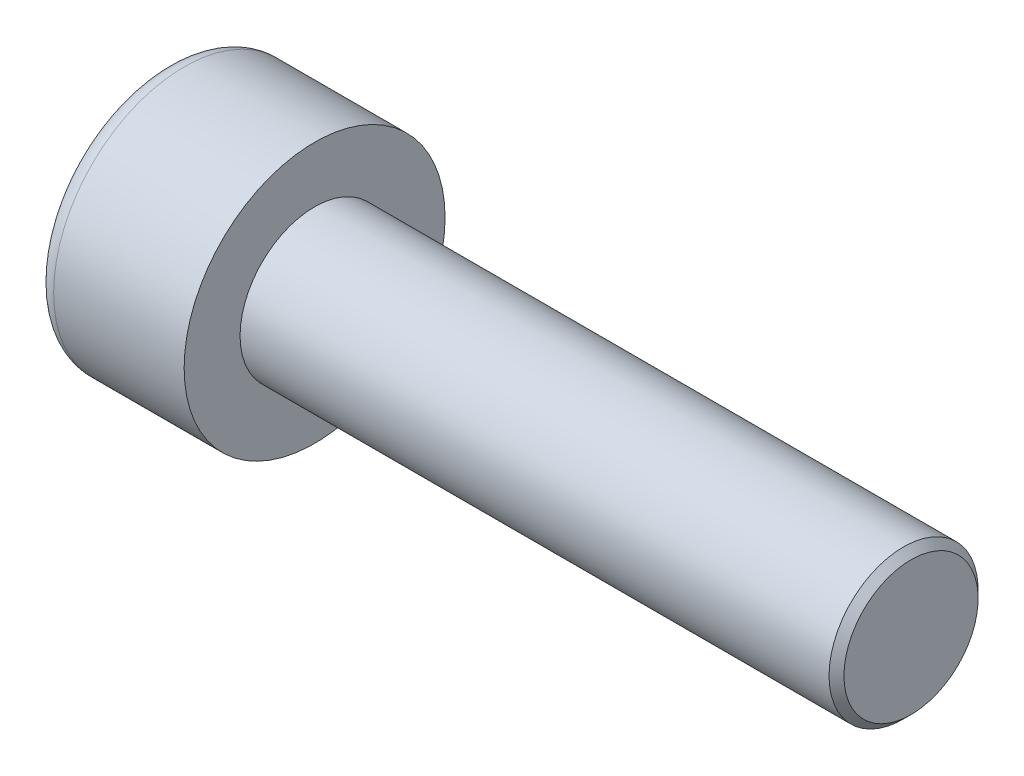
ISO-10303-21;
HEADER;
FILE_DESCRIPTION(('STEP AP214'),'2;1');
FILE_NAME('part.step','',(''),(''),'','','');
FILE_SCHEMA(('AUTOMOTIVE_DESIGN { 1 0 10303 214 1 1 1 1 }'));
ENDSEC;
DATA;
#1=APPLICATION_CONTEXT('core data for automotive mechanical design processes');
#2=APPLICATION_PROTOCOL_DEFINITION('international standard','automotive_design',2000,#1);
#3=PRODUCT_CONTEXT('',#1,'mechanical');
#4=PRODUCT('Part','Part','',(#3));
#5=PRODUCT_RELATED_PRODUCT_CATEGORY('part','',(#4));
#6=PRODUCT_DEFINITION_FORMATION('','',#4);
#7=PRODUCT_DEFINITION_CONTEXT('part definition',#1,'design');
#8=PRODUCT_DEFINITION('design','',#6,#7);
#9=PRODUCT_DEFINITION_SHAPE('','',#8);
#10=(LENGTH_UNIT() NAMED_UNIT(*) SI_UNIT(.MILLI.,.METRE.));
#11=(NAMED_UNIT(*) PLANE_ANGLE_UNIT() SI_UNIT($,.RADIAN.));
#12=(NAMED_UNIT(*) SI_UNIT($,.STERADIAN.) SOLID_ANGLE_UNIT());
#13=UNCERTAINTY_MEASURE_WITH_UNIT(LENGTH_MEASURE(1.E-05),#10,'distance_accuracy_value','');
#14=(GEOMETRIC_REPRESENTATION_CONTEXT(3) GLOBAL_UNCERTAINTY_ASSIGNED_CONTEXT((#13)) GLOBAL_UNIT_ASSIGNED_CONTEXT((#10,
#11,#12)) REPRESENTATION_CONTEXT('',''));
#15=CARTESIAN_POINT('',(0.,0.,0.));
#16=DIRECTION('',(0.,0.,1.));
#17=DIRECTION('',(1.,0.,0.));
#18=AXIS2_PLACEMENT_3D('',#15,#16,#17);
#19=CARTESIAN_POINT('',(0.,0.,0.));
#20=DIRECTION('',(1.,0.,0.));
#21=DIRECTION('',(0.,0.,-1.));
#22=AXIS2_PLACEMENT_3D('',#19,#20,#21);
#23=PLANE('',#22);
#24=DIRECTION('',(0.,0.866025403784439,0.5));
#25=VECTOR('',#24,1.);
#26=CARTESIAN_POINT('',(0.,-1.5,0.866025403784439));
#27=LINE('',#26,#25);
#28=CARTESIAN_POINT('',(0.,-1.5,0.866025403784439));
#29=VERTEX_POINT('',#28);
#30=CARTESIAN_POINT('',(0.,0.,1.73205080756887));
#31=VERTEX_POINT('',#30);
#32=EDGE_CURVE('E91',#29,#31,#27,.T.);
#33=ORIENTED_EDGE('',*,*,#32,.F.);
#34=DIRECTION('',(0.,0.,1.));
#35=VECTOR('',#34,1.);
#36=CARTESIAN_POINT('',(0.,-1.5,-0.866025403784439));
#37=LINE('',#36,#35);
#38=CARTESIAN_POINT('',(0.,-1.5,-0.866025403784439));
#39=VERTEX_POINT('',#38);
#40=EDGE_CURVE('E33',#39,#29,#37,.T.);
#41=ORIENTED_EDGE('',*,*,#40,.F.);
#42=DIRECTION('',(0.,-0.866025403784439,0.5));
#43=VECTOR('',#42,1.);
#44=CARTESIAN_POINT('',(0.,0.,-1.73205080756888));
#45=LINE('',#44,#43);
#46=CARTESIAN_POINT('',(0.,0.,-1.73205080756888));
#47=VERTEX_POINT('',#46);
#48=EDGE_CURVE('E106',#47,#39,#45,.T.);
#49=ORIENTED_EDGE('',*,*,#48,.F.);
#50=DIRECTION('',(0.,-0.866025403784439,-0.5));
#51=VECTOR('',#50,1.);
#52=CARTESIAN_POINT('',(0.,1.5,-0.866025403784439));
#53=LINE('',#52,#51);
#54=CARTESIAN_POINT('',(0.,1.5,-0.866025403784439));
#55=VERTEX_POINT('',#54);
#56=EDGE_CURVE('E100',#55,#47,#53,.T.);
#57=ORIENTED_EDGE('',*,*,#56,.F.);
#58=DIRECTION('',(0.,0.,-1.));
#59=VECTOR('',#58,1.);
#60=CARTESIAN_POINT('',(0.,1.5,0.866025403784437));
#61=LINE('',#60,#59);
#62=CARTESIAN_POINT('',(0.,1.5,0.866025403784437));
#63=VERTEX_POINT('',#62);
#64=EDGE_CURVE('E98',#63,#55,#61,.T.);
#65=ORIENTED_EDGE('',*,*,#64,.F.);
#66=DIRECTION('',(0.,0.866025403784439,-0.5));
#67=VECTOR('',#66,1.);
#68=CARTESIAN_POINT('',(0.,0.,1.73205080756887));
#69=LINE('',#68,#67);
#70=EDGE_CURVE('E84',#31,#63,#69,.T.);
#71=ORIENTED_EDGE('',*,*,#70,.F.);
#72=EDGE_LOOP('',(#33,#41,#49,#57,#65,#71));
#73=FACE_BOUND('',#72,.T.);
#74=CARTESIAN_POINT('',(0.,0.,0.));
#75=DIRECTION('',(-1.,0.,0.));
#76=DIRECTION('',(0.,0.,1.));
#77=AXIS2_PLACEMENT_3D('',#74,#75,#76);
#78=CIRCLE('',#77,3.);
#79=CARTESIAN_POINT('',(0.,0.,3.));
#80=VERTEX_POINT('',#79);
#81=EDGE_CURVE('E12',#80,#80,#78,.T.);
#82=ORIENTED_EDGE('',*,*,#81,.T.);
#83=EDGE_LOOP('',(#82));
#84=FACE_BOUND('',#83,.T.);
#85=ADVANCED_FACE('F19',(#73,#84),#23,.F.);
#86=CARTESIAN_POINT('',(0.5,0.,0.));
#87=DIRECTION('',(-1.,0.,0.));
#88=DIRECTION('',(0.,0.,1.));
#89=AXIS2_PLACEMENT_3D('',#86,#87,#88);
#90=TOROIDAL_SURFACE('',#89,3.,0.5);
#91=ORIENTED_EDGE('',*,*,#81,.F.);
#92=EDGE_LOOP('',(#91));
#93=FACE_BOUND('',#92,.T.);
#94=CARTESIAN_POINT('',(0.5,0.,0.));
#95=DIRECTION('',(-1.,0.,0.));
#96=DIRECTION('',(0.,0.,1.));
#97=AXIS2_PLACEMENT_3D('',#94,#95,#96);
#98=CIRCLE('',#97,3.5);
#99=CARTESIAN_POINT('',(0.5,0.,3.5));
#100=VERTEX_POINT('',#99);
#101=EDGE_CURVE('E26',#100,#100,#98,.T.);
#102=ORIENTED_EDGE('',*,*,#101,.T.);
#103=EDGE_LOOP('',(#102));
#104=FACE_BOUND('',#103,.T.);
#105=ADVANCED_FACE('F132',(#93,#104),#90,.T.);
#106=CARTESIAN_POINT('',(0.,0.,0.));
#107=DIRECTION('',(-1.,0.,0.));
#108=DIRECTION('',(0.,0.,1.));
#109=AXIS2_PLACEMENT_3D('',#106,#107,#108);
#110=CYLINDRICAL_SURFACE('',#109,3.5);
#111=ORIENTED_EDGE('',*,*,#101,.F.);
#112=EDGE_LOOP('',(#111));
#113=FACE_BOUND('',#112,.T.);
#114=CARTESIAN_POINT('',(4.,0.,0.));
#115=DIRECTION('',(-1.,0.,0.));
#116=DIRECTION('',(0.,0.,1.));
#117=AXIS2_PLACEMENT_3D('',#114,#115,#116);
#118=CIRCLE('',#117,3.5);
#119=CARTESIAN_POINT('',(4.,0.,3.5));
#120=VERTEX_POINT('',#119);
#121=EDGE_CURVE('E127',#120,#120,#118,.T.);
#122=ORIENTED_EDGE('',*,*,#121,.T.);
#123=EDGE_LOOP('',(#122));
#124=FACE_BOUND('',#123,.T.);
#125=ADVANCED_FACE('F134',(#113,#124),#110,.T.);
#126=CARTESIAN_POINT('',(4.,3.5,0.));
#127=DIRECTION('',(-1.,0.,0.));
#128=DIRECTION('',(0.,0.,1.));
#129=AXIS2_PLACEMENT_3D('',#126,#127,#128);
#130=PLANE('',#129);
#131=ORIENTED_EDGE('',*,*,#121,.F.);
#132=EDGE_LOOP('',(#131));
#133=FACE_BOUND('',#132,.T.);
#134=CARTESIAN_POINT('',(4.,0.,0.));
#135=DIRECTION('',(-1.,0.,0.));
#136=DIRECTION('',(0.,0.,1.));
#137=AXIS2_PLACEMENT_3D('',#134,#135,#136);
#138=CIRCLE('',#137,2.);
#139=CARTESIAN_POINT('',(4.,0.,2.));
#140=VERTEX_POINT('',#139);
#141=EDGE_CURVE('E124',#140,#140,#138,.T.);
#142=ORIENTED_EDGE('',*,*,#141,.T.);
#143=EDGE_LOOP('',(#142));
#144=FACE_BOUND('',#143,.T.);
#145=ADVANCED_FACE('F137',(#133,#144),#130,.F.);
#146=CARTESIAN_POINT('',(0.,0.,0.));
#147=DIRECTION('',(-1.,0.,0.));
#148=DIRECTION('',(0.,0.,1.));
#149=AXIS2_PLACEMENT_3D('',#146,#147,#148);
#150=CYLINDRICAL_SURFACE('',#149,2.);
#151=ORIENTED_EDGE('',*,*,#141,.F.);
#152=EDGE_LOOP('',(#151));
#153=FACE_BOUND('',#152,.T.);
#154=CARTESIAN_POINT('',(19.8,0.,0.));
#155=DIRECTION('',(-1.,0.,0.));
#156=DIRECTION('',(0.,0.,1.));
#157=AXIS2_PLACEMENT_3D('',#154,#155,#156);
#158=CIRCLE('',#157,2.);
#159=CARTESIAN_POINT('',(19.8,0.,2.));
#160=VERTEX_POINT('',#159);
#161=EDGE_CURVE('E121',#160,#160,#158,.T.);
#162=ORIENTED_EDGE('',*,*,#161,.T.);
#163=EDGE_LOOP('',(#162));
#164=FACE_BOUND('',#163,.T.);
#165=ADVANCED_FACE('F143',(#153,#164),#150,.T.);
#166=CARTESIAN_POINT('',(20.,0.,0.));
#167=DIRECTION('',(-1.,0.,0.));
#168=DIRECTION('',(0.,0.,1.));
#169=AXIS2_PLACEMENT_3D('',#166,#167,#168);
#170=CONICAL_SURFACE('',#169,1.8,0.785398163397452);
#171=ORIENTED_EDGE('',*,*,#161,.F.);
#172=EDGE_LOOP('',(#171));
#173=FACE_BOUND('',#172,.T.);
#174=CARTESIAN_POINT('',(20.,0.,0.));
#175=DIRECTION('',(-1.,0.,0.));
#176=DIRECTION('',(0.,0.,1.));
#177=AXIS2_PLACEMENT_3D('',#174,#175,#176);
#178=CIRCLE('',#177,1.8);
#179=CARTESIAN_POINT('',(20.,0.,1.8));
#180=VERTEX_POINT('',#179);
#181=EDGE_CURVE('E118',#180,#180,#178,.T.);
#182=ORIENTED_EDGE('',*,*,#181,.T.);
#183=EDGE_LOOP('',(#182));
#184=FACE_BOUND('',#183,.T.);
#185=ADVANCED_FACE('F149',(#173,#184),#170,.T.);
#186=CARTESIAN_POINT('',(20.,1.8,0.));
#187=DIRECTION('',(-1.,0.,0.));
#188=DIRECTION('',(0.,0.,1.));
#189=AXIS2_PLACEMENT_3D('',#186,#187,#188);
#190=PLANE('',#189);
#191=ORIENTED_EDGE('',*,*,#181,.F.);
#192=EDGE_LOOP('',(#191));
#193=FACE_BOUND('',#192,.T.);
#194=ADVANCED_FACE('F155',(#193),#190,.F.);
#195=CARTESIAN_POINT('',(8.58257569495584,-1.5,-0.866025403784439));
#196=DIRECTION('',(0.,-1.,0.));
#197=DIRECTION('',(0.,0.,-1.));
#198=AXIS2_PLACEMENT_3D('',#195,#196,#197);
#199=PLANE('',#198);
#200=DIRECTION('',(0.,0.,-1.));
#201=VECTOR('',#200,1.);
#202=CARTESIAN_POINT('',(3.5,-1.5,-0.866025403784439));
#203=LINE('',#202,#201);
#204=CARTESIAN_POINT('',(3.5,-1.5,0.866025403784439));
#205=VERTEX_POINT('',#204);
#206=CARTESIAN_POINT('',(3.5,-1.5,-0.866025403784439));
#207=VERTEX_POINT('',#206);
#208=EDGE_CURVE('E52',#205,#207,#203,.T.);
#209=ORIENTED_EDGE('',*,*,#208,.T.);
#210=DIRECTION('',(-1.,0.,0.));
#211=VECTOR('',#210,1.);
#212=CARTESIAN_POINT('',(8.58257569495584,-1.5,-0.866025403784439));
#213=LINE('',#212,#211);
#214=EDGE_CURVE('E109',#207,#39,#213,.T.);
#215=ORIENTED_EDGE('',*,*,#214,.T.);
#216=ORIENTED_EDGE('',*,*,#40,.T.);
#217=DIRECTION('',(-1.,0.,0.));
#218=VECTOR('',#217,1.);
#219=CARTESIAN_POINT('',(8.58257569495584,-1.5,0.866025403784439));
#220=LINE('',#219,#218);
#221=EDGE_CURVE('E88',#205,#29,#220,.T.);
#222=ORIENTED_EDGE('',*,*,#221,.F.);
#223=EDGE_LOOP('',(#209,#215,#216,#222));
#224=FACE_BOUND('',#223,.T.);
#225=ADVANCED_FACE('F160',(#224),#199,.F.);
#226=CARTESIAN_POINT('',(8.58257569495584,0.,-1.73205080756888));
#227=DIRECTION('',(0.,-0.5,-0.866025403784439));
#228=DIRECTION('',(0.,0.866025403784439,-0.5));
#229=AXIS2_PLACEMENT_3D('',#226,#227,#228);
#230=PLANE('',#229);
#231=DIRECTION('',(0.,0.866025403784439,-0.5));
#232=VECTOR('',#231,1.);
#233=CARTESIAN_POINT('',(3.5,0.,-1.73205080756888));
#234=LINE('',#233,#232);
#235=CARTESIAN_POINT('',(3.5,0.,-1.73205080756888));
#236=VERTEX_POINT('',#235);
#237=EDGE_CURVE('E280',#207,#236,#234,.T.);
#238=ORIENTED_EDGE('',*,*,#237,.T.);
#239=DIRECTION('',(-1.,0.,0.));
#240=VECTOR('',#239,1.);
#241=CARTESIAN_POINT('',(8.58257569495584,0.,-1.73205080756888));
#242=LINE('',#241,#240);
#243=EDGE_CURVE('E111',#236,#47,#242,.T.);
#244=ORIENTED_EDGE('',*,*,#243,.T.);
#245=ORIENTED_EDGE('',*,*,#48,.T.);
#246=ORIENTED_EDGE('',*,*,#214,.F.);
#247=EDGE_LOOP('',(#238,#244,#245,#246));
#248=FACE_BOUND('',#247,.T.);
#249=ADVANCED_FACE('F167',(#248),#230,.F.);
#250=CARTESIAN_POINT('',(8.58257569495584,1.5,-0.866025403784439));
#251=DIRECTION('',(0.,0.5,-0.866025403784439));
#252=DIRECTION('',(0.,0.866025403784439,0.5));
#253=AXIS2_PLACEMENT_3D('',#250,#251,#252);
#254=PLANE('',#253);
#255=DIRECTION('',(0.,0.866025403784439,0.5));
#256=VECTOR('',#255,1.);
#257=CARTESIAN_POINT('',(3.5,1.5,-0.866025403784439));
#258=LINE('',#257,#256);
#259=CARTESIAN_POINT('',(3.5,1.5,-0.866025403784439));
#260=VERTEX_POINT('',#259);
#261=EDGE_CURVE('E283',#236,#260,#258,.T.);
#262=ORIENTED_EDGE('',*,*,#261,.T.);
#263=DIRECTION('',(-1.,0.,0.));
#264=VECTOR('',#263,1.);
#265=CARTESIAN_POINT('',(8.58257569495584,1.5,-0.866025403784439));
#266=LINE('',#265,#264);
#267=EDGE_CURVE('E113',#260,#55,#266,.T.);
#268=ORIENTED_EDGE('',*,*,#267,.T.);
#269=ORIENTED_EDGE('',*,*,#56,.T.);
#270=ORIENTED_EDGE('',*,*,#243,.F.);
#271=EDGE_LOOP('',(#262,#268,#269,#270));
#272=FACE_BOUND('',#271,.T.);
#273=ADVANCED_FACE('F231',(#272),#254,.F.);
#274=CARTESIAN_POINT('',(8.58257569495584,1.5,0.866025403784437));
#275=DIRECTION('',(0.,1.,0.));
#276=DIRECTION('',(0.,0.,1.));
#277=AXIS2_PLACEMENT_3D('',#274,#275,#276);
#278=PLANE('',#277);
#279=DIRECTION('',(0.,0.,1.));
#280=VECTOR('',#279,1.);
#281=CARTESIAN_POINT('',(3.5,1.5,0.866025403784437));
#282=LINE('',#281,#280);
#283=CARTESIAN_POINT('',(3.5,1.5,0.866025403784437));
#284=VERTEX_POINT('',#283);
#285=EDGE_CURVE('E42',#260,#284,#282,.T.);
#286=ORIENTED_EDGE('',*,*,#285,.T.);
#287=DIRECTION('',(-1.,0.,0.));
#288=VECTOR('',#287,1.);
#289=CARTESIAN_POINT('',(8.58257569495584,1.5,0.866025403784437));
#290=LINE('',#289,#288);
#291=EDGE_CURVE('E87',#284,#63,#290,.T.);
#292=ORIENTED_EDGE('',*,*,#291,.T.);
#293=ORIENTED_EDGE('',*,*,#64,.T.);
#294=ORIENTED_EDGE('',*,*,#267,.F.);
#295=EDGE_LOOP('',(#286,#292,#293,#294));
#296=FACE_BOUND('',#295,.T.);
#297=ADVANCED_FACE('F239',(#296),#278,.F.);
#298=CARTESIAN_POINT('',(8.58257569495584,0.,1.73205080756887));
#299=DIRECTION('',(0.,0.5,0.866025403784439));
#300=DIRECTION('',(0.,-0.866025403784439,0.5));
#301=AXIS2_PLACEMENT_3D('',#298,#299,#300);
#302=PLANE('',#301);
#303=DIRECTION('',(0.,-0.866025403784439,0.5));
#304=VECTOR('',#303,1.);
#305=CARTESIAN_POINT('',(3.5,0.,1.73205080756887));
#306=LINE('',#305,#304);
#307=CARTESIAN_POINT('',(3.5,0.,1.73205080756887));
#308=VERTEX_POINT('',#307);
#309=EDGE_CURVE('E86',#284,#308,#306,.T.);
#310=ORIENTED_EDGE('',*,*,#309,.T.);
#311=DIRECTION('',(-1.,0.,0.));
#312=VECTOR('',#311,1.);
#313=CARTESIAN_POINT('',(8.58257569495584,0.,1.73205080756887));
#314=LINE('',#313,#312);
#315=EDGE_CURVE('E79',#308,#31,#314,.T.);
#316=ORIENTED_EDGE('',*,*,#315,.T.);
#317=ORIENTED_EDGE('',*,*,#70,.T.);
#318=ORIENTED_EDGE('',*,*,#291,.F.);
#319=EDGE_LOOP('',(#310,#316,#317,#318));
#320=FACE_BOUND('',#319,.T.);
#321=ADVANCED_FACE('F81',(#320),#302,.F.);
#322=CARTESIAN_POINT('',(8.58257569495584,-1.5,0.866025403784439));
#323=DIRECTION('',(0.,-0.5,0.866025403784439));
#324=DIRECTION('',(0.,-0.866025403784439,-0.5));
#325=AXIS2_PLACEMENT_3D('',#322,#323,#324);
#326=PLANE('',#325);
#327=DIRECTION('',(0.,-0.866025403784439,-0.5));
#328=VECTOR('',#327,1.);
#329=CARTESIAN_POINT('',(3.5,-1.5,0.866025403784439));
#330=LINE('',#329,#328);
#331=EDGE_CURVE('E61',#308,#205,#330,.T.);
#332=ORIENTED_EDGE('',*,*,#331,.T.);
#333=ORIENTED_EDGE('',*,*,#221,.T.);
#334=ORIENTED_EDGE('',*,*,#32,.T.);
#335=ORIENTED_EDGE('',*,*,#315,.F.);
#336=EDGE_LOOP('',(#332,#333,#334,#335));
#337=FACE_BOUND('',#336,.T.);
#338=ADVANCED_FACE('F92',(#337),#326,.F.);
#339=CARTESIAN_POINT('',(3.5,3.5,0.));
#340=DIRECTION('',(-1.,0.,0.));
#341=DIRECTION('',(0.,0.,1.));
#342=AXIS2_PLACEMENT_3D('',#339,#340,#341);
#343=PLANE('',#342);
#344=ORIENTED_EDGE('',*,*,#208,.F.);
#345=ORIENTED_EDGE('',*,*,#331,.F.);
#346=ORIENTED_EDGE('',*,*,#309,.F.);
#347=ORIENTED_EDGE('',*,*,#285,.F.);
#348=ORIENTED_EDGE('',*,*,#261,.F.);
#349=ORIENTED_EDGE('',*,*,#237,.F.);
#350=EDGE_LOOP('',(#344,#345,#346,#347,#348,#349));
#351=FACE_BOUND('',#350,.T.);
#352=ADVANCED_FACE('F262',(#351),#343,.T.);
#353=CLOSED_SHELL('',(#85,#105,#125,#145,#165,#185,#194,#225,#249,#273,#297,#321,#338,#352));
#354=MANIFOLD_SOLID_BREP('B1',#353);
#355=ADVANCED_BREP_SHAPE_REPRESENTATION('',(#18,#354),#14);
#356=SHAPE_DEFINITION_REPRESENTATION(#9,#355);
ENDSEC;
END-ISO-10303-21;
